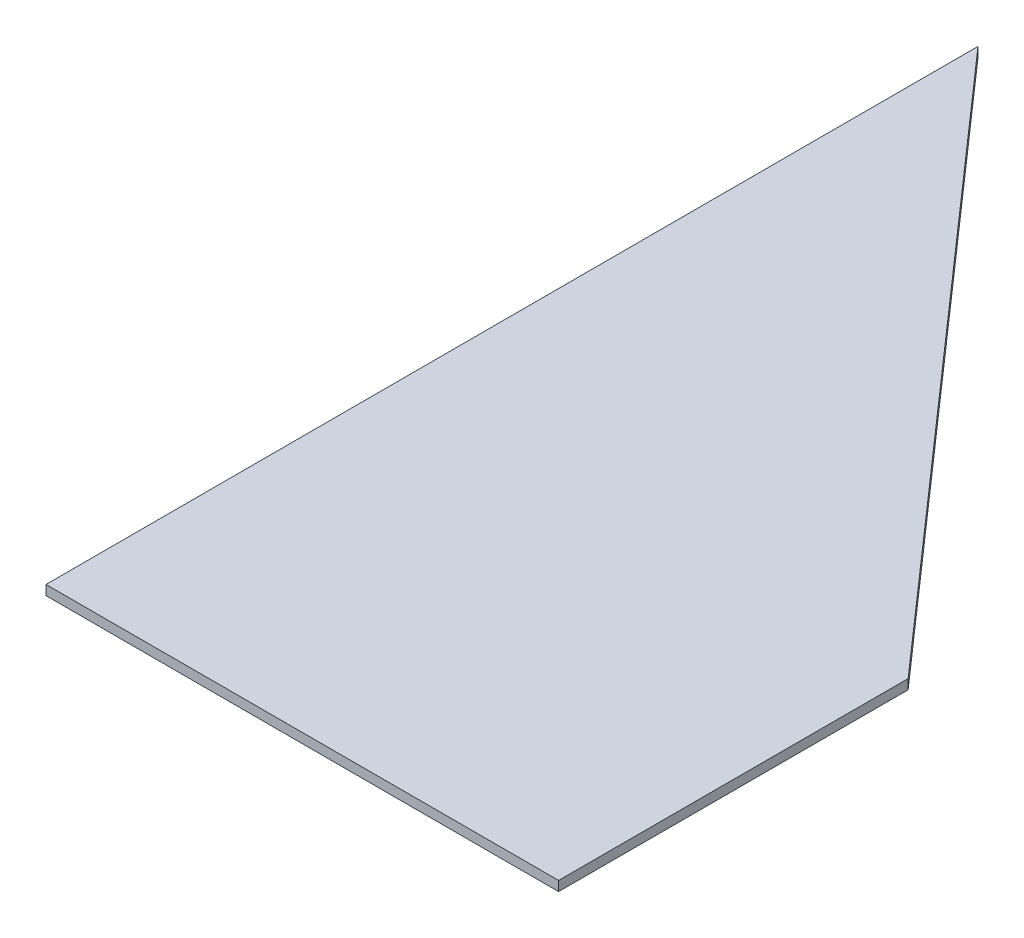
ISO-10303-21;
HEADER;
FILE_DESCRIPTION(('STEP AP214'),'2;1');
FILE_NAME('part.step','',(''),(''),'','','');
FILE_SCHEMA(('AUTOMOTIVE_DESIGN { 1 0 10303 214 1 1 1 1 }'));
ENDSEC;
DATA;
#1=APPLICATION_CONTEXT('core data for automotive mechanical design processes');
#2=APPLICATION_PROTOCOL_DEFINITION('international standard','automotive_design',2000,#1);
#3=PRODUCT_CONTEXT('',#1,'mechanical');
#4=PRODUCT('Part','Part','',(#3));
#5=PRODUCT_RELATED_PRODUCT_CATEGORY('part','',(#4));
#6=PRODUCT_DEFINITION_FORMATION('','',#4);
#7=PRODUCT_DEFINITION_CONTEXT('part definition',#1,'design');
#8=PRODUCT_DEFINITION('design','',#6,#7);
#9=PRODUCT_DEFINITION_SHAPE('','',#8);
#10=(LENGTH_UNIT() NAMED_UNIT(*) SI_UNIT(.MILLI.,.METRE.));
#11=(NAMED_UNIT(*) PLANE_ANGLE_UNIT() SI_UNIT($,.RADIAN.));
#12=(NAMED_UNIT(*) SI_UNIT($,.STERADIAN.) SOLID_ANGLE_UNIT());
#13=UNCERTAINTY_MEASURE_WITH_UNIT(LENGTH_MEASURE(1.E-05),#10,'distance_accuracy_value','');
#14=(GEOMETRIC_REPRESENTATION_CONTEXT(3) GLOBAL_UNCERTAINTY_ASSIGNED_CONTEXT((#13)) GLOBAL_UNIT_ASSIGNED_CONTEXT((#10,
#11,#12)) REPRESENTATION_CONTEXT('',''));
#15=CARTESIAN_POINT('',(0.,0.,0.));
#16=DIRECTION('',(0.,0.,1.));
#17=DIRECTION('',(1.,0.,0.));
#18=AXIS2_PLACEMENT_3D('',#15,#16,#17);
#19=CARTESIAN_POINT('',(0.,3.175,-304.8));
#20=DIRECTION('',(1.,0.,0.));
#21=DIRECTION('',(0.,0.,-1.));
#22=AXIS2_PLACEMENT_3D('',#19,#20,#21);
#23=PLANE('',#22);
#24=DIRECTION('',(0.,0.,1.));
#25=VECTOR('',#24,1.);
#26=CARTESIAN_POINT('',(0.,0.,-304.8));
#27=LINE('',#26,#25);
#28=CARTESIAN_POINT('',(0.,0.,-304.8));
#29=VERTEX_POINT('',#28);
#30=CARTESIAN_POINT('',(0.,0.,0.));
#31=VERTEX_POINT('',#30);
#32=EDGE_CURVE('E100',#29,#31,#27,.T.);
#33=ORIENTED_EDGE('',*,*,#32,.T.);
#34=DIRECTION('',(0.,-1.,0.));
#35=VECTOR('',#34,1.);
#36=CARTESIAN_POINT('',(0.,3.175,0.));
#37=LINE('',#36,#35);
#38=CARTESIAN_POINT('',(0.,3.175,0.));
#39=VERTEX_POINT('',#38);
#40=EDGE_CURVE('E11',#39,#31,#37,.T.);
#41=ORIENTED_EDGE('',*,*,#40,.F.);
#42=DIRECTION('',(0.,0.,1.));
#43=VECTOR('',#42,1.);
#44=CARTESIAN_POINT('',(0.,3.175,-304.8));
#45=LINE('',#44,#43);
#46=CARTESIAN_POINT('',(0.,3.175,-304.8));
#47=VERTEX_POINT('',#46);
#48=EDGE_CURVE('E88',#47,#39,#45,.T.);
#49=ORIENTED_EDGE('',*,*,#48,.F.);
#50=DIRECTION('',(0.,-1.,0.));
#51=VECTOR('',#50,1.);
#52=CARTESIAN_POINT('',(0.,3.175,-304.8));
#53=LINE('',#52,#51);
#54=EDGE_CURVE('E96',#47,#29,#53,.T.);
#55=ORIENTED_EDGE('',*,*,#54,.T.);
#56=EDGE_LOOP('',(#33,#41,#49,#55));
#57=FACE_BOUND('',#56,.T.);
#58=ADVANCED_FACE('F37',(#57),#23,.F.);
#59=CARTESIAN_POINT('',(0.,3.175,0.));
#60=DIRECTION('',(0.,0.,-1.));
#61=DIRECTION('',(-1.,0.,0.));
#62=AXIS2_PLACEMENT_3D('',#59,#60,#61);
#63=PLANE('',#62);
#64=DIRECTION('',(1.,0.,0.));
#65=VECTOR('',#64,1.);
#66=CARTESIAN_POINT('',(0.,0.,0.));
#67=LINE('',#66,#65);
#68=CARTESIAN_POINT('',(167.64,0.,0.));
#69=VERTEX_POINT('',#68);
#70=EDGE_CURVE('E92',#31,#69,#67,.T.);
#71=ORIENTED_EDGE('',*,*,#70,.T.);
#72=DIRECTION('',(0.,-1.,0.));
#73=VECTOR('',#72,1.);
#74=CARTESIAN_POINT('',(167.64,3.175,0.));
#75=LINE('',#74,#73);
#76=CARTESIAN_POINT('',(167.64,3.175,0.));
#77=VERTEX_POINT('',#76);
#78=EDGE_CURVE('E45',#77,#69,#75,.T.);
#79=ORIENTED_EDGE('',*,*,#78,.F.);
#80=DIRECTION('',(1.,0.,0.));
#81=VECTOR('',#80,1.);
#82=CARTESIAN_POINT('',(0.,3.175,0.));
#83=LINE('',#82,#81);
#84=EDGE_CURVE('E83',#39,#77,#83,.T.);
#85=ORIENTED_EDGE('',*,*,#84,.F.);
#86=ORIENTED_EDGE('',*,*,#40,.T.);
#87=EDGE_LOOP('',(#71,#79,#85,#86));
#88=FACE_BOUND('',#87,.T.);
#89=ADVANCED_FACE('F91',(#88),#63,.F.);
#90=CARTESIAN_POINT('',(167.64,3.175,0.));
#91=DIRECTION('',(-1.,0.,0.));
#92=DIRECTION('',(0.,0.,1.));
#93=AXIS2_PLACEMENT_3D('',#90,#91,#92);
#94=PLANE('',#93);
#95=DIRECTION('',(0.,0.,-1.));
#96=VECTOR('',#95,1.);
#97=CARTESIAN_POINT('',(167.64,0.,0.));
#98=LINE('',#97,#96);
#99=CARTESIAN_POINT('',(167.64,0.,-114.3));
#100=VERTEX_POINT('',#99);
#101=EDGE_CURVE('E70',#69,#100,#98,.T.);
#102=ORIENTED_EDGE('',*,*,#101,.T.);
#103=DIRECTION('',(0.,-1.,0.));
#104=VECTOR('',#103,1.);
#105=CARTESIAN_POINT('',(167.64,3.175,-114.3));
#106=LINE('',#105,#104);
#107=CARTESIAN_POINT('',(167.64,3.175,-114.3));
#108=VERTEX_POINT('',#107);
#109=EDGE_CURVE('E93',#108,#100,#106,.T.);
#110=ORIENTED_EDGE('',*,*,#109,.F.);
#111=DIRECTION('',(0.,0.,-1.));
#112=VECTOR('',#111,1.);
#113=CARTESIAN_POINT('',(167.64,3.175,0.));
#114=LINE('',#113,#112);
#115=EDGE_CURVE('E86',#77,#108,#114,.T.);
#116=ORIENTED_EDGE('',*,*,#115,.F.);
#117=ORIENTED_EDGE('',*,*,#78,.T.);
#118=EDGE_LOOP('',(#102,#110,#116,#117));
#119=FACE_BOUND('',#118,.T.);
#120=ADVANCED_FACE('F94',(#119),#94,.F.);
#121=CARTESIAN_POINT('',(167.64,3.175,-114.3));
#122=DIRECTION('',(-0.750713516922755,0.,0.660627894892025));
#123=DIRECTION('',(0.660627894892025,0.,0.750713516922755));
#124=AXIS2_PLACEMENT_3D('',#121,#122,#123);
#125=PLANE('',#124);
#126=DIRECTION('',(-0.660627894892025,0.,-0.750713516922755));
#127=VECTOR('',#126,1.);
#128=CARTESIAN_POINT('',(167.64,0.,-114.3));
#129=LINE('',#128,#127);
#130=EDGE_CURVE('E76',#100,#29,#129,.T.);
#131=ORIENTED_EDGE('',*,*,#130,.T.);
#132=ORIENTED_EDGE('',*,*,#54,.F.);
#133=DIRECTION('',(-0.660627894892025,0.,-0.750713516922755));
#134=VECTOR('',#133,1.);
#135=CARTESIAN_POINT('',(167.64,3.175,-114.3));
#136=LINE('',#135,#134);
#137=EDGE_CURVE('E53',#108,#47,#136,.T.);
#138=ORIENTED_EDGE('',*,*,#137,.F.);
#139=ORIENTED_EDGE('',*,*,#109,.T.);
#140=EDGE_LOOP('',(#131,#132,#138,#139));
#141=FACE_BOUND('',#140,.T.);
#142=ADVANCED_FACE('F107',(#141),#125,.F.);
#143=CARTESIAN_POINT('',(0.,3.175,0.));
#144=DIRECTION('',(0.,1.,0.));
#145=DIRECTION('',(0.,0.,1.));
#146=AXIS2_PLACEMENT_3D('',#143,#144,#145);
#147=PLANE('',#146);
#148=ORIENTED_EDGE('',*,*,#48,.T.);
#149=ORIENTED_EDGE('',*,*,#84,.T.);
#150=ORIENTED_EDGE('',*,*,#115,.T.);
#151=ORIENTED_EDGE('',*,*,#137,.T.);
#152=EDGE_LOOP('',(#148,#149,#150,#151));
#153=FACE_BOUND('',#152,.T.);
#154=ADVANCED_FACE('F84',(#153),#147,.T.);
#155=CARTESIAN_POINT('',(0.,0.,0.));
#156=DIRECTION('',(0.,1.,0.));
#157=DIRECTION('',(0.,0.,1.));
#158=AXIS2_PLACEMENT_3D('',#155,#156,#157);
#159=PLANE('',#158);
#160=ORIENTED_EDGE('',*,*,#32,.F.);
#161=ORIENTED_EDGE('',*,*,#130,.F.);
#162=ORIENTED_EDGE('',*,*,#101,.F.);
#163=ORIENTED_EDGE('',*,*,#70,.F.);
#164=EDGE_LOOP('',(#160,#161,#162,#163));
#165=FACE_BOUND('',#164,.T.);
#166=ADVANCED_FACE('F110',(#165),#159,.F.);
#167=CLOSED_SHELL('',(#58,#89,#120,#142,#154,#166));
#168=MANIFOLD_SOLID_BREP('B2',#167);
#169=ADVANCED_BREP_SHAPE_REPRESENTATION('',(#18,#168),#14);
#170=SHAPE_DEFINITION_REPRESENTATION(#9,#169);
ENDSEC;
END-ISO-10303-21;
